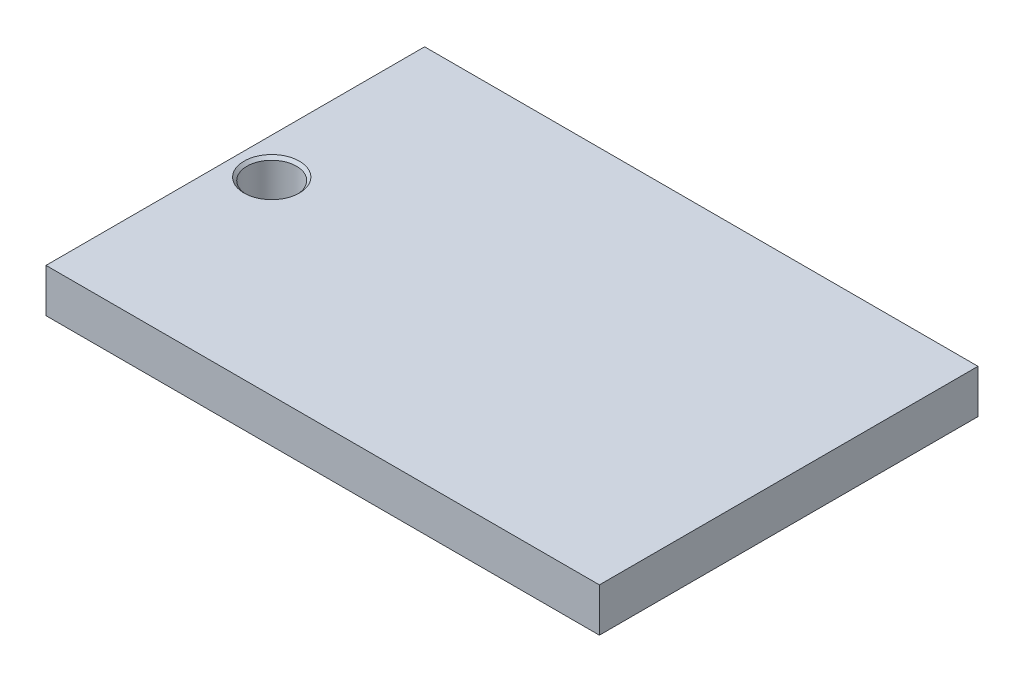
ISO-10303-21;
HEADER;
FILE_DESCRIPTION(('STEP AP214'),'2;1');
FILE_NAME('part.step','',(''),(''),'','','');
FILE_SCHEMA(('AUTOMOTIVE_DESIGN { 1 0 10303 214 1 1 1 1 }'));
ENDSEC;
DATA;
#1=APPLICATION_CONTEXT('core data for automotive mechanical design processes');
#2=APPLICATION_PROTOCOL_DEFINITION('international standard','automotive_design',2000,#1);
#3=PRODUCT_CONTEXT('',#1,'mechanical');
#4=PRODUCT('Part','Part','',(#3));
#5=PRODUCT_RELATED_PRODUCT_CATEGORY('part','',(#4));
#6=PRODUCT_DEFINITION_FORMATION('','',#4);
#7=PRODUCT_DEFINITION_CONTEXT('part definition',#1,'design');
#8=PRODUCT_DEFINITION('design','',#6,#7);
#9=PRODUCT_DEFINITION_SHAPE('','',#8);
#10=(LENGTH_UNIT() NAMED_UNIT(*) SI_UNIT(.MILLI.,.METRE.));
#11=(NAMED_UNIT(*) PLANE_ANGLE_UNIT() SI_UNIT($,.RADIAN.));
#12=(NAMED_UNIT(*) SI_UNIT($,.STERADIAN.) SOLID_ANGLE_UNIT());
#13=UNCERTAINTY_MEASURE_WITH_UNIT(LENGTH_MEASURE(1.E-05),#10,'distance_accuracy_value','');
#14=(GEOMETRIC_REPRESENTATION_CONTEXT(3) GLOBAL_UNCERTAINTY_ASSIGNED_CONTEXT((#13)) GLOBAL_UNIT_ASSIGNED_CONTEXT((#10,
#11,#12)) REPRESENTATION_CONTEXT('',''));
#15=CARTESIAN_POINT('',(0.,0.,0.));
#16=DIRECTION('',(0.,0.,1.));
#17=DIRECTION('',(1.,0.,0.));
#18=AXIS2_PLACEMENT_3D('',#15,#16,#17);
#19=CARTESIAN_POINT('',(24.12492,3.80111,16.50492));
#20=DIRECTION('',(-1.,0.,0.));
#21=DIRECTION('',(0.,0.,1.));
#22=AXIS2_PLACEMENT_3D('',#19,#20,#21);
#23=PLANE('',#22);
#24=DIRECTION('',(0.,0.,-1.));
#25=VECTOR('',#24,1.);
#26=CARTESIAN_POINT('',(24.12492,0.,16.50492));
#27=LINE('',#26,#25);
#28=CARTESIAN_POINT('',(24.12492,0.,16.50492));
#29=VERTEX_POINT('',#28);
#30=CARTESIAN_POINT('',(24.12492,0.,-16.50492));
#31=VERTEX_POINT('',#30);
#32=EDGE_CURVE('E115',#29,#31,#27,.T.);
#33=ORIENTED_EDGE('',*,*,#32,.T.);
#34=DIRECTION('',(0.,-1.,0.));
#35=VECTOR('',#34,1.);
#36=CARTESIAN_POINT('',(24.12492,3.80111,-16.50492));
#37=LINE('',#36,#35);
#38=CARTESIAN_POINT('',(24.12492,3.80111,-16.50492));
#39=VERTEX_POINT('',#38);
#40=EDGE_CURVE('E103',#39,#31,#37,.T.);
#41=ORIENTED_EDGE('',*,*,#40,.F.);
#42=DIRECTION('',(0.,0.,-1.));
#43=VECTOR('',#42,1.);
#44=CARTESIAN_POINT('',(24.12492,3.80111,16.50492));
#45=LINE('',#44,#43);
#46=CARTESIAN_POINT('',(24.12492,3.80111,16.50492));
#47=VERTEX_POINT('',#46);
#48=EDGE_CURVE('E100',#47,#39,#45,.T.);
#49=ORIENTED_EDGE('',*,*,#48,.F.);
#50=DIRECTION('',(0.,-1.,0.));
#51=VECTOR('',#50,1.);
#52=CARTESIAN_POINT('',(24.12492,3.80111,16.50492));
#53=LINE('',#52,#51);
#54=EDGE_CURVE('E107',#47,#29,#53,.T.);
#55=ORIENTED_EDGE('',*,*,#54,.T.);
#56=EDGE_LOOP('',(#33,#41,#49,#55));
#57=FACE_BOUND('',#56,.T.);
#58=ADVANCED_FACE('F43',(#57),#23,.F.);
#59=CARTESIAN_POINT('',(-24.12492,3.80111,-16.50492));
#60=DIRECTION('',(0.,0.,1.));
#61=DIRECTION('',(1.,0.,0.));
#62=AXIS2_PLACEMENT_3D('',#59,#60,#61);
#63=PLANE('',#62);
#64=DIRECTION('',(-1.,0.,0.));
#65=VECTOR('',#64,1.);
#66=CARTESIAN_POINT('',(-24.12492,0.,-16.50492));
#67=LINE('',#66,#65);
#68=CARTESIAN_POINT('',(-24.12492,0.,-16.50492));
#69=VERTEX_POINT('',#68);
#70=EDGE_CURVE('E105',#31,#69,#67,.T.);
#71=ORIENTED_EDGE('',*,*,#70,.T.);
#72=DIRECTION('',(0.,-1.,0.));
#73=VECTOR('',#72,1.);
#74=CARTESIAN_POINT('',(-24.12492,3.80111,-16.50492));
#75=LINE('',#74,#73);
#76=CARTESIAN_POINT('',(-24.12492,3.80111,-16.50492));
#77=VERTEX_POINT('',#76);
#78=EDGE_CURVE('E99',#77,#69,#75,.T.);
#79=ORIENTED_EDGE('',*,*,#78,.F.);
#80=DIRECTION('',(-1.,0.,0.));
#81=VECTOR('',#80,1.);
#82=CARTESIAN_POINT('',(-24.12492,3.80111,-16.50492));
#83=LINE('',#82,#81);
#84=EDGE_CURVE('E95',#39,#77,#83,.T.);
#85=ORIENTED_EDGE('',*,*,#84,.F.);
#86=ORIENTED_EDGE('',*,*,#40,.T.);
#87=EDGE_LOOP('',(#71,#79,#85,#86));
#88=FACE_BOUND('',#87,.T.);
#89=ADVANCED_FACE('F101',(#88),#63,.F.);
#90=CARTESIAN_POINT('',(-24.12492,3.80111,16.50492));
#91=DIRECTION('',(1.,0.,0.));
#92=DIRECTION('',(0.,0.,-1.));
#93=AXIS2_PLACEMENT_3D('',#90,#91,#92);
#94=PLANE('',#93);
#95=DIRECTION('',(0.,0.,1.));
#96=VECTOR('',#95,1.);
#97=CARTESIAN_POINT('',(-24.12492,0.,16.50492));
#98=LINE('',#97,#96);
#99=CARTESIAN_POINT('',(-24.12492,0.,16.50492));
#100=VERTEX_POINT('',#99);
#101=EDGE_CURVE('E77',#69,#100,#98,.T.);
#102=ORIENTED_EDGE('',*,*,#101,.T.);
#103=DIRECTION('',(0.,-1.,0.));
#104=VECTOR('',#103,1.);
#105=CARTESIAN_POINT('',(-24.12492,3.80111,16.50492));
#106=LINE('',#105,#104);
#107=CARTESIAN_POINT('',(-24.12492,3.80111,16.50492));
#108=VERTEX_POINT('',#107);
#109=EDGE_CURVE('E102',#108,#100,#106,.T.);
#110=ORIENTED_EDGE('',*,*,#109,.F.);
#111=DIRECTION('',(0.,0.,1.));
#112=VECTOR('',#111,1.);
#113=CARTESIAN_POINT('',(-24.12492,3.80111,16.50492));
#114=LINE('',#113,#112);
#115=EDGE_CURVE('E92',#77,#108,#114,.T.);
#116=ORIENTED_EDGE('',*,*,#115,.F.);
#117=ORIENTED_EDGE('',*,*,#78,.T.);
#118=EDGE_LOOP('',(#102,#110,#116,#117));
#119=FACE_BOUND('',#118,.T.);
#120=ADVANCED_FACE('F106',(#119),#94,.F.);
#121=CARTESIAN_POINT('',(-24.12492,3.80111,16.50492));
#122=DIRECTION('',(0.,0.,-1.));
#123=DIRECTION('',(-1.,0.,0.));
#124=AXIS2_PLACEMENT_3D('',#121,#122,#123);
#125=PLANE('',#124);
#126=DIRECTION('',(1.,0.,0.));
#127=VECTOR('',#126,1.);
#128=CARTESIAN_POINT('',(-24.12492,0.,16.50492));
#129=LINE('',#128,#127);
#130=EDGE_CURVE('E82',#100,#29,#129,.T.);
#131=ORIENTED_EDGE('',*,*,#130,.T.);
#132=ORIENTED_EDGE('',*,*,#54,.F.);
#133=DIRECTION('',(1.,0.,0.));
#134=VECTOR('',#133,1.);
#135=CARTESIAN_POINT('',(-24.12492,3.80111,16.50492));
#136=LINE('',#135,#134);
#137=EDGE_CURVE('E61',#108,#47,#136,.T.);
#138=ORIENTED_EDGE('',*,*,#137,.F.);
#139=ORIENTED_EDGE('',*,*,#109,.T.);
#140=EDGE_LOOP('',(#131,#132,#138,#139));
#141=FACE_BOUND('',#140,.T.);
#142=ADVANCED_FACE('F141',(#141),#125,.F.);
#143=CARTESIAN_POINT('',(0.,3.80111,0.));
#144=DIRECTION('',(0.,-1.,0.));
#145=DIRECTION('',(0.,0.,-1.));
#146=AXIS2_PLACEMENT_3D('',#143,#144,#145);
#147=PLANE('',#146);
#148=CARTESIAN_POINT('',(-20.94992,3.80111,0.));
#149=DIRECTION('',(0.,-1.,0.));
#150=DIRECTION('',(0.,0.,-1.));
#151=AXIS2_PLACEMENT_3D('',#148,#149,#150);
#152=CIRCLE('',#151,2.41299999999998);
#153=CARTESIAN_POINT('',(-20.94992,3.80111,-2.41299999999998));
#154=VERTEX_POINT('',#153);
#155=EDGE_CURVE('E11',#154,#154,#152,.T.);
#156=ORIENTED_EDGE('',*,*,#155,.T.);
#157=EDGE_LOOP('',(#156));
#158=FACE_BOUND('',#157,.T.);
#159=ORIENTED_EDGE('',*,*,#48,.T.);
#160=ORIENTED_EDGE('',*,*,#84,.T.);
#161=ORIENTED_EDGE('',*,*,#115,.T.);
#162=ORIENTED_EDGE('',*,*,#137,.T.);
#163=EDGE_LOOP('',(#159,#160,#161,#162));
#164=FACE_BOUND('',#163,.T.);
#165=ADVANCED_FACE('F91',(#158,#164),#147,.F.);
#166=CARTESIAN_POINT('',(0.,0.,0.));
#167=DIRECTION('',(0.,-1.,0.));
#168=DIRECTION('',(0.,0.,-1.));
#169=AXIS2_PLACEMENT_3D('',#166,#167,#168);
#170=PLANE('',#169);
#171=CARTESIAN_POINT('',(-20.94992,0.,0.));
#172=DIRECTION('',(0.,-1.,0.));
#173=DIRECTION('',(0.,0.,-1.));
#174=AXIS2_PLACEMENT_3D('',#171,#172,#173);
#175=CIRCLE('',#174,2.413);
#176=CARTESIAN_POINT('',(-20.94992,0.,-2.413));
#177=VERTEX_POINT('',#176);
#178=EDGE_CURVE('E121',#177,#177,#175,.F.);
#179=ORIENTED_EDGE('',*,*,#178,.T.);
#180=EDGE_LOOP('',(#179));
#181=FACE_BOUND('',#180,.T.);
#182=ORIENTED_EDGE('',*,*,#32,.F.);
#183=ORIENTED_EDGE('',*,*,#130,.F.);
#184=ORIENTED_EDGE('',*,*,#101,.F.);
#185=ORIENTED_EDGE('',*,*,#70,.F.);
#186=EDGE_LOOP('',(#182,#183,#184,#185));
#187=FACE_BOUND('',#186,.T.);
#188=ADVANCED_FACE('F140',(#181,#187),#170,.T.);
#189=CARTESIAN_POINT('',(-20.94992,-0.00100000000000013,0.));
#190=DIRECTION('',(0.,1.,0.));
#191=DIRECTION('',(0.,0.,1.));
#192=AXIS2_PLACEMENT_3D('',#189,#190,#191);
#193=CYLINDRICAL_SURFACE('',#192,2.159);
#194=CARTESIAN_POINT('',(-20.94992,0.253999999999996,0.));
#195=DIRECTION('',(0.,-1.,0.));
#196=DIRECTION('',(0.,0.,-1.));
#197=AXIS2_PLACEMENT_3D('',#194,#195,#196);
#198=CIRCLE('',#197,2.159);
#199=CARTESIAN_POINT('',(-20.94992,0.253999999999996,-2.159));
#200=VERTEX_POINT('',#199);
#201=EDGE_CURVE('E52',#200,#200,#198,.T.);
#202=ORIENTED_EDGE('',*,*,#201,.T.);
#203=EDGE_LOOP('',(#202));
#204=FACE_BOUND('',#203,.T.);
#205=CARTESIAN_POINT('',(-20.94992,3.54711000000002,0.));
#206=DIRECTION('',(0.,-1.,0.));
#207=DIRECTION('',(0.,0.,-1.));
#208=AXIS2_PLACEMENT_3D('',#205,#206,#207);
#209=CIRCLE('',#208,2.159);
#210=CARTESIAN_POINT('',(-20.94992,3.54711000000002,-2.159));
#211=VERTEX_POINT('',#210);
#212=EDGE_CURVE('E122',#211,#211,#209,.F.);
#213=ORIENTED_EDGE('',*,*,#212,.T.);
#214=EDGE_LOOP('',(#213));
#215=FACE_BOUND('',#214,.T.);
#216=ADVANCED_FACE('F129',(#204,#215),#193,.F.);
#217=CARTESIAN_POINT('',(-20.94992,0.,0.));
#218=DIRECTION('',(0.,-1.,0.));
#219=DIRECTION('',(0.,0.,-1.));
#220=AXIS2_PLACEMENT_3D('',#217,#218,#219);
#221=CONICAL_SURFACE('',#220,2.413,0.78539816339745);
#222=ORIENTED_EDGE('',*,*,#201,.F.);
#223=EDGE_LOOP('',(#222));
#224=FACE_BOUND('',#223,.T.);
#225=ORIENTED_EDGE('',*,*,#178,.F.);
#226=EDGE_LOOP('',(#225));
#227=FACE_BOUND('',#226,.T.);
#228=ADVANCED_FACE('F135',(#224,#227),#221,.F.);
#229=CARTESIAN_POINT('',(-20.94992,3.54711000000002,0.));
#230=DIRECTION('',(0.,1.,0.));
#231=DIRECTION('',(0.,0.,1.));
#232=AXIS2_PLACEMENT_3D('',#229,#230,#231);
#233=CONICAL_SURFACE('',#232,2.159,0.785398163397447);
#234=ORIENTED_EDGE('',*,*,#155,.F.);
#235=EDGE_LOOP('',(#234));
#236=FACE_BOUND('',#235,.T.);
#237=ORIENTED_EDGE('',*,*,#212,.F.);
#238=EDGE_LOOP('',(#237));
#239=FACE_BOUND('',#238,.T.);
#240=ADVANCED_FACE('F46',(#236,#239),#233,.F.);
#241=CLOSED_SHELL('',(#58,#89,#120,#142,#165,#188,#216,#228,#240));
#242=MANIFOLD_SOLID_BREP('B2',#241);
#243=ADVANCED_BREP_SHAPE_REPRESENTATION('',(#18,#242),#14);
#244=SHAPE_DEFINITION_REPRESENTATION(#9,#243);
ENDSEC;
END-ISO-10303-21;
